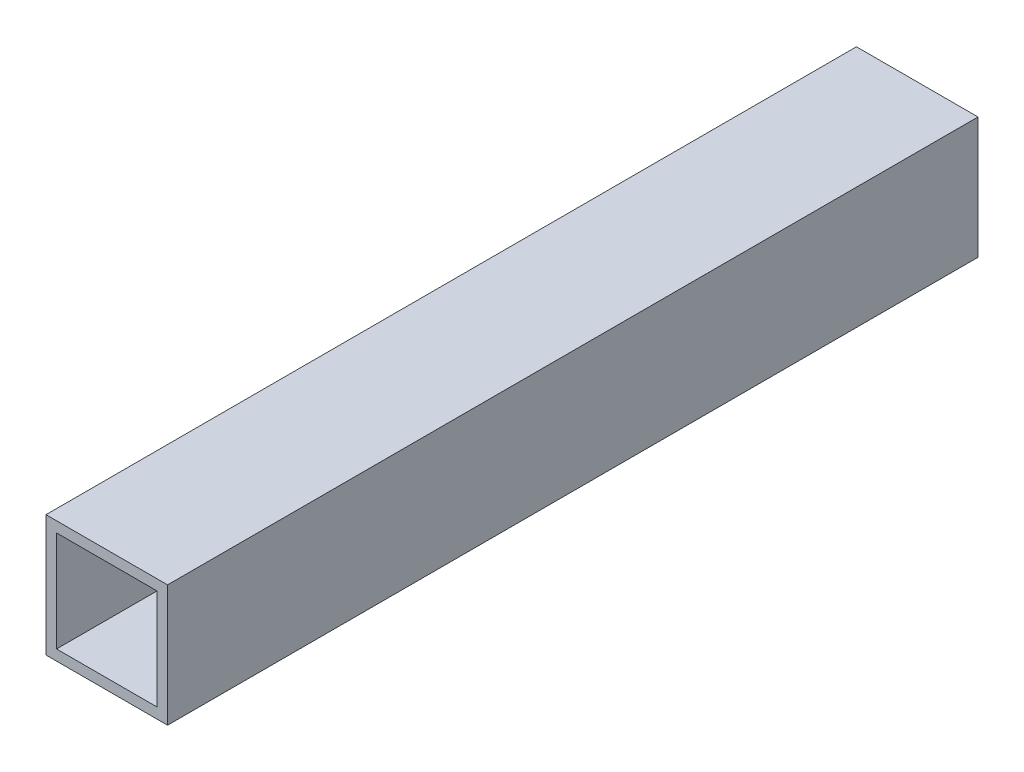
ISO-10303-21;
HEADER;
FILE_DESCRIPTION(('STEP AP214'),'2;1');
FILE_NAME('part.step','',(''),(''),'','','');
FILE_SCHEMA(('AUTOMOTIVE_DESIGN { 1 0 10303 214 1 1 1 1 }'));
ENDSEC;
DATA;
#1=APPLICATION_CONTEXT('core data for automotive mechanical design processes');
#2=APPLICATION_PROTOCOL_DEFINITION('international standard','automotive_design',2000,#1);
#3=PRODUCT_CONTEXT('',#1,'mechanical');
#4=PRODUCT('Part','Part','',(#3));
#5=PRODUCT_RELATED_PRODUCT_CATEGORY('part','',(#4));
#6=PRODUCT_DEFINITION_FORMATION('','',#4);
#7=PRODUCT_DEFINITION_CONTEXT('part definition',#1,'design');
#8=PRODUCT_DEFINITION('design','',#6,#7);
#9=PRODUCT_DEFINITION_SHAPE('','',#8);
#10=(LENGTH_UNIT() NAMED_UNIT(*) SI_UNIT(.MILLI.,.METRE.));
#11=(NAMED_UNIT(*) PLANE_ANGLE_UNIT() SI_UNIT($,.RADIAN.));
#12=(NAMED_UNIT(*) SI_UNIT($,.STERADIAN.) SOLID_ANGLE_UNIT());
#13=UNCERTAINTY_MEASURE_WITH_UNIT(LENGTH_MEASURE(1.E-05),#10,'distance_accuracy_value','');
#14=(GEOMETRIC_REPRESENTATION_CONTEXT(3) GLOBAL_UNCERTAINTY_ASSIGNED_CONTEXT((#13)) GLOBAL_UNIT_ASSIGNED_CONTEXT((#10,
#11,#12)) REPRESENTATION_CONTEXT('',''));
#15=CARTESIAN_POINT('',(0.,0.,0.));
#16=DIRECTION('',(0.,0.,1.));
#17=DIRECTION('',(1.,0.,0.));
#18=AXIS2_PLACEMENT_3D('',#15,#16,#17);
#19=CARTESIAN_POINT('',(19.05,19.05,254.));
#20=DIRECTION('',(0.,0.,-1.));
#21=DIRECTION('',(-1.,0.,0.));
#22=AXIS2_PLACEMENT_3D('',#19,#20,#21);
#23=PLANE('',#22);
#24=DIRECTION('',(0.,1.,0.));
#25=VECTOR('',#24,1.);
#26=CARTESIAN_POINT('',(19.05,-19.05,254.));
#27=LINE('',#26,#25);
#28=CARTESIAN_POINT('',(19.05,-19.05,254.));
#29=VERTEX_POINT('',#28);
#30=CARTESIAN_POINT('',(19.05,19.05,254.));
#31=VERTEX_POINT('',#30);
#32=EDGE_CURVE('E134',#29,#31,#27,.T.);
#33=ORIENTED_EDGE('',*,*,#32,.T.);
#34=DIRECTION('',(-1.,0.,0.));
#35=VECTOR('',#34,1.);
#36=CARTESIAN_POINT('',(-19.05,19.05,254.));
#37=LINE('',#36,#35);
#38=CARTESIAN_POINT('',(-19.05,19.05,254.));
#39=VERTEX_POINT('',#38);
#40=EDGE_CURVE('E137',#31,#39,#37,.T.);
#41=ORIENTED_EDGE('',*,*,#40,.T.);
#42=DIRECTION('',(0.,-1.,0.));
#43=VECTOR('',#42,1.);
#44=CARTESIAN_POINT('',(-19.05,-19.05,254.));
#45=LINE('',#44,#43);
#46=CARTESIAN_POINT('',(-19.05,-19.05,254.));
#47=VERTEX_POINT('',#46);
#48=EDGE_CURVE('E140',#39,#47,#45,.T.);
#49=ORIENTED_EDGE('',*,*,#48,.T.);
#50=DIRECTION('',(1.,0.,0.));
#51=VECTOR('',#50,1.);
#52=CARTESIAN_POINT('',(-19.05,-19.05,254.));
#53=LINE('',#52,#51);
#54=EDGE_CURVE('E142',#47,#29,#53,.T.);
#55=ORIENTED_EDGE('',*,*,#54,.T.);
#56=EDGE_LOOP('',(#33,#41,#49,#55));
#57=FACE_BOUND('',#56,.T.);
#58=DIRECTION('',(0.,1.,0.));
#59=VECTOR('',#58,1.);
#60=CARTESIAN_POINT('',(15.748,-15.748,254.));
#61=LINE('',#60,#59);
#62=CARTESIAN_POINT('',(15.748,-15.748,254.));
#63=VERTEX_POINT('',#62);
#64=CARTESIAN_POINT('',(15.748,15.748,254.));
#65=VERTEX_POINT('',#64);
#66=EDGE_CURVE('E98',#63,#65,#61,.T.);
#67=ORIENTED_EDGE('',*,*,#66,.F.);
#68=DIRECTION('',(1.,0.,0.));
#69=VECTOR('',#68,1.);
#70=CARTESIAN_POINT('',(-15.748,-15.748,254.));
#71=LINE('',#70,#69);
#72=CARTESIAN_POINT('',(-15.748,-15.748,254.));
#73=VERTEX_POINT('',#72);
#74=EDGE_CURVE('E120',#73,#63,#71,.T.);
#75=ORIENTED_EDGE('',*,*,#74,.F.);
#76=DIRECTION('',(0.,-1.,0.));
#77=VECTOR('',#76,1.);
#78=CARTESIAN_POINT('',(-15.748,-15.748,254.));
#79=LINE('',#78,#77);
#80=CARTESIAN_POINT('',(-15.748,15.748,254.));
#81=VERTEX_POINT('',#80);
#82=EDGE_CURVE('E118',#81,#73,#79,.T.);
#83=ORIENTED_EDGE('',*,*,#82,.F.);
#84=DIRECTION('',(-1.,0.,0.));
#85=VECTOR('',#84,1.);
#86=CARTESIAN_POINT('',(-15.748,15.748,254.));
#87=LINE('',#86,#85);
#88=EDGE_CURVE('E106',#65,#81,#87,.T.);
#89=ORIENTED_EDGE('',*,*,#88,.F.);
#90=EDGE_LOOP('',(#67,#75,#83,#89));
#91=FACE_BOUND('',#90,.T.);
#92=ADVANCED_FACE('F33',(#57,#91),#23,.F.);
#93=CARTESIAN_POINT('',(19.05,19.05,0.));
#94=DIRECTION('',(0.,0.,-1.));
#95=DIRECTION('',(-1.,0.,0.));
#96=AXIS2_PLACEMENT_3D('',#93,#94,#95);
#97=PLANE('',#96);
#98=DIRECTION('',(0.,1.,0.));
#99=VECTOR('',#98,1.);
#100=CARTESIAN_POINT('',(19.05,-19.05,0.));
#101=LINE('',#100,#99);
#102=CARTESIAN_POINT('',(19.05,-19.05,0.));
#103=VERTEX_POINT('',#102);
#104=CARTESIAN_POINT('',(19.05,19.05,0.));
#105=VERTEX_POINT('',#104);
#106=EDGE_CURVE('E114',#103,#105,#101,.T.);
#107=ORIENTED_EDGE('',*,*,#106,.F.);
#108=DIRECTION('',(1.,0.,0.));
#109=VECTOR('',#108,1.);
#110=CARTESIAN_POINT('',(-19.05,-19.05,0.));
#111=LINE('',#110,#109);
#112=CARTESIAN_POINT('',(-19.05,-19.05,0.));
#113=VERTEX_POINT('',#112);
#114=EDGE_CURVE('E138',#113,#103,#111,.T.);
#115=ORIENTED_EDGE('',*,*,#114,.F.);
#116=DIRECTION('',(0.,-1.,0.));
#117=VECTOR('',#116,1.);
#118=CARTESIAN_POINT('',(-19.05,-19.05,0.));
#119=LINE('',#118,#117);
#120=CARTESIAN_POINT('',(-19.05,19.05,0.));
#121=VERTEX_POINT('',#120);
#122=EDGE_CURVE('E149',#121,#113,#119,.T.);
#123=ORIENTED_EDGE('',*,*,#122,.F.);
#124=DIRECTION('',(-1.,0.,0.));
#125=VECTOR('',#124,1.);
#126=CARTESIAN_POINT('',(-19.05,19.05,0.));
#127=LINE('',#126,#125);
#128=EDGE_CURVE('E147',#105,#121,#127,.T.);
#129=ORIENTED_EDGE('',*,*,#128,.F.);
#130=EDGE_LOOP('',(#107,#115,#123,#129));
#131=FACE_BOUND('',#130,.T.);
#132=DIRECTION('',(1.,0.,0.));
#133=VECTOR('',#132,1.);
#134=CARTESIAN_POINT('',(-15.748,-15.748,0.));
#135=LINE('',#134,#133);
#136=CARTESIAN_POINT('',(-15.748,-15.748,0.));
#137=VERTEX_POINT('',#136);
#138=CARTESIAN_POINT('',(15.748,-15.748,0.));
#139=VERTEX_POINT('',#138);
#140=EDGE_CURVE('E107',#137,#139,#135,.T.);
#141=ORIENTED_EDGE('',*,*,#140,.T.);
#142=DIRECTION('',(0.,1.,0.));
#143=VECTOR('',#142,1.);
#144=CARTESIAN_POINT('',(15.748,-15.748,0.));
#145=LINE('',#144,#143);
#146=CARTESIAN_POINT('',(15.748,15.748,0.));
#147=VERTEX_POINT('',#146);
#148=EDGE_CURVE('E56',#139,#147,#145,.T.);
#149=ORIENTED_EDGE('',*,*,#148,.T.);
#150=DIRECTION('',(-1.,0.,0.));
#151=VECTOR('',#150,1.);
#152=CARTESIAN_POINT('',(-15.748,15.748,0.));
#153=LINE('',#152,#151);
#154=CARTESIAN_POINT('',(-15.748,15.748,0.));
#155=VERTEX_POINT('',#154);
#156=EDGE_CURVE('E113',#147,#155,#153,.T.);
#157=ORIENTED_EDGE('',*,*,#156,.T.);
#158=DIRECTION('',(0.,-1.,0.));
#159=VECTOR('',#158,1.);
#160=CARTESIAN_POINT('',(-15.748,-15.748,0.));
#161=LINE('',#160,#159);
#162=EDGE_CURVE('E126',#155,#137,#161,.T.);
#163=ORIENTED_EDGE('',*,*,#162,.T.);
#164=EDGE_LOOP('',(#141,#149,#157,#163));
#165=FACE_BOUND('',#164,.T.);
#166=ADVANCED_FACE('F167',(#131,#165),#97,.T.);
#167=CARTESIAN_POINT('',(19.05,-19.05,254.));
#168=DIRECTION('',(-1.,0.,0.));
#169=DIRECTION('',(0.,0.,1.));
#170=AXIS2_PLACEMENT_3D('',#167,#168,#169);
#171=PLANE('',#170);
#172=ORIENTED_EDGE('',*,*,#106,.T.);
#173=DIRECTION('',(0.,0.,-1.));
#174=VECTOR('',#173,1.);
#175=CARTESIAN_POINT('',(19.05,19.05,254.));
#176=LINE('',#175,#174);
#177=EDGE_CURVE('E11',#31,#105,#176,.T.);
#178=ORIENTED_EDGE('',*,*,#177,.F.);
#179=ORIENTED_EDGE('',*,*,#32,.F.);
#180=DIRECTION('',(0.,0.,-1.));
#181=VECTOR('',#180,1.);
#182=CARTESIAN_POINT('',(19.05,-19.05,254.));
#183=LINE('',#182,#181);
#184=EDGE_CURVE('E144',#29,#103,#183,.T.);
#185=ORIENTED_EDGE('',*,*,#184,.T.);
#186=EDGE_LOOP('',(#172,#178,#179,#185));
#187=FACE_BOUND('',#186,.T.);
#188=ADVANCED_FACE('F35',(#187),#171,.F.);
#189=CARTESIAN_POINT('',(-19.05,19.05,254.));
#190=DIRECTION('',(0.,-1.,0.));
#191=DIRECTION('',(0.,0.,-1.));
#192=AXIS2_PLACEMENT_3D('',#189,#190,#191);
#193=PLANE('',#192);
#194=ORIENTED_EDGE('',*,*,#128,.T.);
#195=DIRECTION('',(0.,0.,-1.));
#196=VECTOR('',#195,1.);
#197=CARTESIAN_POINT('',(-19.05,19.05,254.));
#198=LINE('',#197,#196);
#199=EDGE_CURVE('E41',#39,#121,#198,.T.);
#200=ORIENTED_EDGE('',*,*,#199,.F.);
#201=ORIENTED_EDGE('',*,*,#40,.F.);
#202=ORIENTED_EDGE('',*,*,#177,.T.);
#203=EDGE_LOOP('',(#194,#200,#201,#202));
#204=FACE_BOUND('',#203,.T.);
#205=ADVANCED_FACE('F177',(#204),#193,.F.);
#206=CARTESIAN_POINT('',(-19.05,-19.05,254.));
#207=DIRECTION('',(1.,0.,0.));
#208=DIRECTION('',(0.,0.,-1.));
#209=AXIS2_PLACEMENT_3D('',#206,#207,#208);
#210=PLANE('',#209);
#211=ORIENTED_EDGE('',*,*,#122,.T.);
#212=DIRECTION('',(0.,0.,-1.));
#213=VECTOR('',#212,1.);
#214=CARTESIAN_POINT('',(-19.05,-19.05,254.));
#215=LINE('',#214,#213);
#216=EDGE_CURVE('E154',#47,#113,#215,.T.);
#217=ORIENTED_EDGE('',*,*,#216,.F.);
#218=ORIENTED_EDGE('',*,*,#48,.F.);
#219=ORIENTED_EDGE('',*,*,#199,.T.);
#220=EDGE_LOOP('',(#211,#217,#218,#219));
#221=FACE_BOUND('',#220,.T.);
#222=ADVANCED_FACE('F161',(#221),#210,.F.);
#223=CARTESIAN_POINT('',(-19.05,-19.05,254.));
#224=DIRECTION('',(0.,1.,0.));
#225=DIRECTION('',(0.,0.,1.));
#226=AXIS2_PLACEMENT_3D('',#223,#224,#225);
#227=PLANE('',#226);
#228=ORIENTED_EDGE('',*,*,#114,.T.);
#229=ORIENTED_EDGE('',*,*,#184,.F.);
#230=ORIENTED_EDGE('',*,*,#54,.F.);
#231=ORIENTED_EDGE('',*,*,#216,.T.);
#232=EDGE_LOOP('',(#228,#229,#230,#231));
#233=FACE_BOUND('',#232,.T.);
#234=ADVANCED_FACE('F171',(#233),#227,.F.);
#235=CARTESIAN_POINT('',(15.748,-15.748,254.));
#236=DIRECTION('',(-1.,0.,0.));
#237=DIRECTION('',(0.,0.,1.));
#238=AXIS2_PLACEMENT_3D('',#235,#236,#237);
#239=PLANE('',#238);
#240=ORIENTED_EDGE('',*,*,#148,.F.);
#241=DIRECTION('',(0.,0.,-1.));
#242=VECTOR('',#241,1.);
#243=CARTESIAN_POINT('',(15.748,-15.748,254.));
#244=LINE('',#243,#242);
#245=EDGE_CURVE('E102',#63,#139,#244,.T.);
#246=ORIENTED_EDGE('',*,*,#245,.F.);
#247=ORIENTED_EDGE('',*,*,#66,.T.);
#248=DIRECTION('',(0.,0.,-1.));
#249=VECTOR('',#248,1.);
#250=CARTESIAN_POINT('',(15.748,15.748,254.));
#251=LINE('',#250,#249);
#252=EDGE_CURVE('E101',#65,#147,#251,.T.);
#253=ORIENTED_EDGE('',*,*,#252,.T.);
#254=EDGE_LOOP('',(#240,#246,#247,#253));
#255=FACE_BOUND('',#254,.T.);
#256=ADVANCED_FACE('F100',(#255),#239,.T.);
#257=CARTESIAN_POINT('',(-15.748,15.748,254.));
#258=DIRECTION('',(0.,-1.,0.));
#259=DIRECTION('',(0.,0.,-1.));
#260=AXIS2_PLACEMENT_3D('',#257,#258,#259);
#261=PLANE('',#260);
#262=ORIENTED_EDGE('',*,*,#156,.F.);
#263=ORIENTED_EDGE('',*,*,#252,.F.);
#264=ORIENTED_EDGE('',*,*,#88,.T.);
#265=DIRECTION('',(0.,0.,-1.));
#266=VECTOR('',#265,1.);
#267=CARTESIAN_POINT('',(-15.748,15.748,254.));
#268=LINE('',#267,#266);
#269=EDGE_CURVE('E115',#81,#155,#268,.T.);
#270=ORIENTED_EDGE('',*,*,#269,.T.);
#271=EDGE_LOOP('',(#262,#263,#264,#270));
#272=FACE_BOUND('',#271,.T.);
#273=ADVANCED_FACE('F110',(#272),#261,.T.);
#274=CARTESIAN_POINT('',(-15.748,-15.748,254.));
#275=DIRECTION('',(1.,0.,0.));
#276=DIRECTION('',(0.,0.,-1.));
#277=AXIS2_PLACEMENT_3D('',#274,#275,#276);
#278=PLANE('',#277);
#279=ORIENTED_EDGE('',*,*,#162,.F.);
#280=ORIENTED_EDGE('',*,*,#269,.F.);
#281=ORIENTED_EDGE('',*,*,#82,.T.);
#282=DIRECTION('',(0.,0.,-1.));
#283=VECTOR('',#282,1.);
#284=CARTESIAN_POINT('',(-15.748,-15.748,254.));
#285=LINE('',#284,#283);
#286=EDGE_CURVE('E48',#73,#137,#285,.T.);
#287=ORIENTED_EDGE('',*,*,#286,.T.);
#288=EDGE_LOOP('',(#279,#280,#281,#287));
#289=FACE_BOUND('',#288,.T.);
#290=ADVANCED_FACE('F200',(#289),#278,.T.);
#291=CARTESIAN_POINT('',(-15.748,-15.748,254.));
#292=DIRECTION('',(0.,1.,0.));
#293=DIRECTION('',(0.,0.,1.));
#294=AXIS2_PLACEMENT_3D('',#291,#292,#293);
#295=PLANE('',#294);
#296=ORIENTED_EDGE('',*,*,#140,.F.);
#297=ORIENTED_EDGE('',*,*,#286,.F.);
#298=ORIENTED_EDGE('',*,*,#74,.T.);
#299=ORIENTED_EDGE('',*,*,#245,.T.);
#300=EDGE_LOOP('',(#296,#297,#298,#299));
#301=FACE_BOUND('',#300,.T.);
#302=ADVANCED_FACE('F204',(#301),#295,.T.);
#303=CLOSED_SHELL('',(#92,#166,#188,#205,#222,#234,#256,#273,#290,#302));
#304=MANIFOLD_SOLID_BREP('B2',#303);
#305=ADVANCED_BREP_SHAPE_REPRESENTATION('',(#18,#304),#14);
#306=SHAPE_DEFINITION_REPRESENTATION(#9,#305);
ENDSEC;
END-ISO-10303-21;
